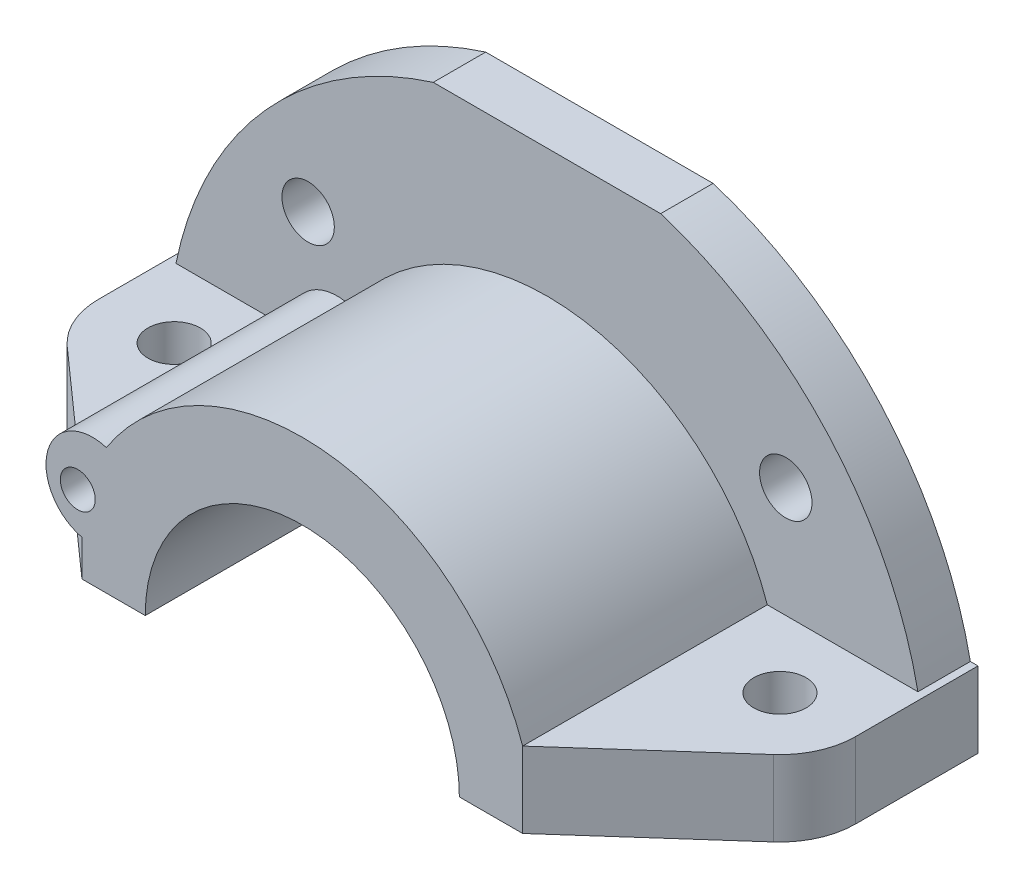
ISO-10303-21;
HEADER;
FILE_DESCRIPTION(('STEP AP214'),'2;1');
FILE_NAME('part.step','',(''),(''),'','','');
FILE_SCHEMA(('AUTOMOTIVE_DESIGN { 1 0 10303 214 1 1 1 1 }'));
ENDSEC;
DATA;
#1=APPLICATION_CONTEXT('core data for automotive mechanical design processes');
#2=APPLICATION_PROTOCOL_DEFINITION('international standard','automotive_design',2000,#1);
#3=PRODUCT_CONTEXT('',#1,'mechanical');
#4=PRODUCT('Part','Part','',(#3));
#5=PRODUCT_RELATED_PRODUCT_CATEGORY('part','',(#4));
#6=PRODUCT_DEFINITION_FORMATION('','',#4);
#7=PRODUCT_DEFINITION_CONTEXT('part definition',#1,'design');
#8=PRODUCT_DEFINITION('design','',#6,#7);
#9=PRODUCT_DEFINITION_SHAPE('','',#8);
#10=(LENGTH_UNIT() NAMED_UNIT(*) SI_UNIT(.MILLI.,.METRE.));
#11=(NAMED_UNIT(*) PLANE_ANGLE_UNIT() SI_UNIT($,.RADIAN.));
#12=(NAMED_UNIT(*) SI_UNIT($,.STERADIAN.) SOLID_ANGLE_UNIT());
#13=UNCERTAINTY_MEASURE_WITH_UNIT(LENGTH_MEASURE(1.E-05),#10,'distance_accuracy_value','');
#14=(GEOMETRIC_REPRESENTATION_CONTEXT(3) GLOBAL_UNCERTAINTY_ASSIGNED_CONTEXT((#13)) GLOBAL_UNIT_ASSIGNED_CONTEXT((#10,
#11,#12)) REPRESENTATION_CONTEXT('',''));
#15=CARTESIAN_POINT('',(0.,0.,0.));
#16=DIRECTION('',(0.,0.,1.));
#17=DIRECTION('',(1.,0.,0.));
#18=AXIS2_PLACEMENT_3D('',#15,#16,#17);
#19=CARTESIAN_POINT('',(0.,13.,51.));
#20=DIRECTION('',(0.,1.,0.));
#21=DIRECTION('',(0.,0.,1.));
#22=AXIS2_PLACEMENT_3D('',#19,#20,#21);
#23=PLANE('',#22);
#24=DIRECTION('',(0.,0.,1.));
#25=VECTOR('',#24,1.);
#26=CARTESIAN_POINT('',(-43.9372539331938,13.,-13.6274169979695));
#27=LINE('',#26,#25);
#28=CARTESIAN_POINT('',(-43.9372539331938,13.,9.));
#29=VERTEX_POINT('',#28);
#30=CARTESIAN_POINT('',(-43.9372539331938,13.,45.5674390370028));
#31=VERTEX_POINT('',#30);
#32=EDGE_CURVE('E197',#29,#31,#27,.T.);
#33=ORIENTED_EDGE('',*,*,#32,.F.);
#34=DIRECTION('',(1.,0.,0.));
#35=VECTOR('',#34,1.);
#36=CARTESIAN_POINT('',(0.,13.,9.));
#37=LINE('',#36,#35);
#38=CARTESIAN_POINT('',(-63.6867333123626,13.,9.));
#39=VERTEX_POINT('',#38);
#40=EDGE_CURVE('E261',#39,#29,#37,.T.);
#41=ORIENTED_EDGE('',*,*,#40,.F.);
#42=DIRECTION('',(0.,0.,-1.));
#43=VECTOR('',#42,1.);
#44=CARTESIAN_POINT('',(-63.6867333123626,13.,9.));
#45=LINE('',#44,#43);
#46=CARTESIAN_POINT('',(-63.6867333123626,13.,0.));
#47=VERTEX_POINT('',#46);
#48=EDGE_CURVE('E286',#39,#47,#45,.T.);
#49=ORIENTED_EDGE('',*,*,#48,.T.);
#50=DIRECTION('',(1.,0.,0.));
#51=VECTOR('',#50,1.);
#52=CARTESIAN_POINT('',(0.,13.,0.));
#53=LINE('',#52,#51);
#54=CARTESIAN_POINT('',(-65.,13.,0.));
#55=VERTEX_POINT('',#54);
#56=EDGE_CURVE('E304',#55,#47,#53,.T.);
#57=ORIENTED_EDGE('',*,*,#56,.F.);
#58=DIRECTION('',(0.,0.,-1.));
#59=VECTOR('',#58,1.);
#60=CARTESIAN_POINT('',(-65.,13.,51.));
#61=LINE('',#60,#59);
#62=CARTESIAN_POINT('',(-65.,13.,21.));
#63=VERTEX_POINT('',#62);
#64=EDGE_CURVE('E312',#63,#55,#61,.T.);
#65=ORIENTED_EDGE('',*,*,#64,.F.);
#66=CARTESIAN_POINT('',(-52.,13.,21.));
#67=DIRECTION('',(0.,1.,0.));
#68=DIRECTION('',(0.,0.,1.));
#69=AXIS2_PLACEMENT_3D('',#66,#67,#68);
#70=CIRCLE('',#69,13.);
#71=CARTESIAN_POINT('',(-60.6390494366874,13.,30.714258841027));
#72=VERTEX_POINT('',#71);
#73=EDGE_CURVE('E204',#72,#63,#70,.F.);
#74=ORIENTED_EDGE('',*,*,#73,.F.);
#75=DIRECTION('',(-0.747250680078999,0.,-0.664542264360571));
#76=VECTOR('',#75,1.);
#77=CARTESIAN_POINT('',(-16.7057135654639,13.,69.7848937418742));
#78=LINE('',#77,#76);
#79=EDGE_CURVE('E216',#31,#72,#78,.T.);
#80=ORIENTED_EDGE('',*,*,#79,.F.);
#81=EDGE_LOOP('',(#33,#41,#49,#57,#65,#74,#80));
#82=FACE_BOUND('',#81,.T.);
#83=CARTESIAN_POINT('',(-52.,13.,21.));
#84=DIRECTION('',(0.,1.,0.));
#85=DIRECTION('',(0.,0.,1.));
#86=AXIS2_PLACEMENT_3D('',#83,#84,#85);
#87=CIRCLE('',#86,4.5);
#88=CARTESIAN_POINT('',(-52.,13.,25.5));
#89=VERTEX_POINT('',#88);
#90=EDGE_CURVE('E218',#89,#89,#87,.F.);
#91=ORIENTED_EDGE('',*,*,#90,.T.);
#92=EDGE_LOOP('',(#91));
#93=FACE_BOUND('',#92,.T.);
#94=ADVANCED_FACE('F60',(#82,#93),#23,.T.);
#95=CARTESIAN_POINT('',(0.,0.,51.));
#96=DIRECTION('',(0.,1.,0.));
#97=DIRECTION('',(0.,0.,1.));
#98=AXIS2_PLACEMENT_3D('',#95,#96,#97);
#99=PLANE('',#98);
#100=CARTESIAN_POINT('',(-52.,0.,21.));
#101=DIRECTION('',(0.,1.,0.));
#102=DIRECTION('',(0.,0.,1.));
#103=AXIS2_PLACEMENT_3D('',#100,#101,#102);
#104=CIRCLE('',#103,4.5);
#105=CARTESIAN_POINT('',(-52.,0.,25.5));
#106=VERTEX_POINT('',#105);
#107=EDGE_CURVE('E223',#106,#106,#104,.F.);
#108=ORIENTED_EDGE('',*,*,#107,.F.);
#109=EDGE_LOOP('',(#108));
#110=FACE_BOUND('',#109,.T.);
#111=DIRECTION('',(1.,0.,0.));
#112=VECTOR('',#111,1.);
#113=CARTESIAN_POINT('',(0.,0.,51.));
#114=LINE('',#113,#112);
#115=CARTESIAN_POINT('',(-37.8285606387555,0.,51.));
#116=VERTEX_POINT('',#115);
#117=CARTESIAN_POINT('',(-26.965,0.,51.));
#118=VERTEX_POINT('',#117);
#119=EDGE_CURVE('E320',#116,#118,#114,.T.);
#120=ORIENTED_EDGE('',*,*,#119,.F.);
#121=DIRECTION('',(-0.747250680078998,0.,-0.664542264360571));
#122=VECTOR('',#121,1.);
#123=CARTESIAN_POINT('',(-37.8285606387555,0.,51.));
#124=LINE('',#123,#122);
#125=CARTESIAN_POINT('',(-60.6390494366874,0.,30.714258841027));
#126=VERTEX_POINT('',#125);
#127=EDGE_CURVE('E202',#116,#126,#124,.T.);
#128=ORIENTED_EDGE('',*,*,#127,.T.);
#129=CARTESIAN_POINT('',(-52.,0.,21.));
#130=DIRECTION('',(0.,-1.,0.));
#131=DIRECTION('',(0.,0.,-1.));
#132=AXIS2_PLACEMENT_3D('',#129,#130,#131);
#133=CIRCLE('',#132,13.);
#134=CARTESIAN_POINT('',(-65.,0.,21.));
#135=VERTEX_POINT('',#134);
#136=EDGE_CURVE('E206',#126,#135,#133,.T.);
#137=ORIENTED_EDGE('',*,*,#136,.T.);
#138=DIRECTION('',(0.,0.,-1.));
#139=VECTOR('',#138,1.);
#140=CARTESIAN_POINT('',(-65.,0.,51.));
#141=LINE('',#140,#139);
#142=CARTESIAN_POINT('',(-65.,0.,0.));
#143=VERTEX_POINT('',#142);
#144=EDGE_CURVE('E310',#135,#143,#141,.T.);
#145=ORIENTED_EDGE('',*,*,#144,.T.);
#146=DIRECTION('',(1.,0.,0.));
#147=VECTOR('',#146,1.);
#148=CARTESIAN_POINT('',(0.,0.,0.));
#149=LINE('',#148,#147);
#150=CARTESIAN_POINT('',(-26.965,0.,0.));
#151=VERTEX_POINT('',#150);
#152=EDGE_CURVE('E328',#143,#151,#149,.T.);
#153=ORIENTED_EDGE('',*,*,#152,.T.);
#154=DIRECTION('',(0.,0.,-1.));
#155=VECTOR('',#154,1.);
#156=CARTESIAN_POINT('',(-26.965,0.,51.));
#157=LINE('',#156,#155);
#158=EDGE_CURVE('E68',#118,#151,#157,.T.);
#159=ORIENTED_EDGE('',*,*,#158,.F.);
#160=EDGE_LOOP('',(#120,#128,#137,#145,#153,#159));
#161=FACE_BOUND('',#160,.T.);
#162=ADVANCED_FACE('F340',(#110,#161),#99,.F.);
#163=CARTESIAN_POINT('',(-65.,0.,51.));
#164=DIRECTION('',(-1.,0.,0.));
#165=DIRECTION('',(0.,0.,1.));
#166=AXIS2_PLACEMENT_3D('',#163,#164,#165);
#167=PLANE('',#166);
#168=ORIENTED_EDGE('',*,*,#144,.F.);
#169=DIRECTION('',(0.,1.,0.));
#170=VECTOR('',#169,1.);
#171=CARTESIAN_POINT('',(-65.,0.,21.));
#172=LINE('',#171,#170);
#173=EDGE_CURVE('E208',#135,#63,#172,.T.);
#174=ORIENTED_EDGE('',*,*,#173,.T.);
#175=ORIENTED_EDGE('',*,*,#64,.T.);
#176=DIRECTION('',(0.,1.,0.));
#177=VECTOR('',#176,1.);
#178=CARTESIAN_POINT('',(-65.,0.,0.));
#179=LINE('',#178,#177);
#180=EDGE_CURVE('E307',#143,#55,#179,.T.);
#181=ORIENTED_EDGE('',*,*,#180,.F.);
#182=EDGE_LOOP('',(#168,#174,#175,#181));
#183=FACE_BOUND('',#182,.T.);
#184=ADVANCED_FACE('F370',(#183),#167,.T.);
#185=CARTESIAN_POINT('',(0.,13.,51.));
#186=DIRECTION('',(0.,1.,0.));
#187=DIRECTION('',(0.,0.,1.));
#188=AXIS2_PLACEMENT_3D('',#185,#186,#187);
#189=PLANE('',#188);
#190=CARTESIAN_POINT('',(52.,13.,21.));
#191=DIRECTION('',(0.,1.,0.));
#192=DIRECTION('',(0.,0.,1.));
#193=AXIS2_PLACEMENT_3D('',#190,#191,#192);
#194=CIRCLE('',#193,13.);
#195=CARTESIAN_POINT('',(60.6390494366874,13.,30.714258841027));
#196=VERTEX_POINT('',#195);
#197=CARTESIAN_POINT('',(65.,13.,21.));
#198=VERTEX_POINT('',#197);
#199=EDGE_CURVE('E233',#196,#198,#194,.T.);
#200=ORIENTED_EDGE('',*,*,#199,.T.);
#201=DIRECTION('',(0.,0.,-1.));
#202=VECTOR('',#201,1.);
#203=CARTESIAN_POINT('',(65.,13.,51.));
#204=LINE('',#203,#202);
#205=CARTESIAN_POINT('',(65.,13.,0.));
#206=VERTEX_POINT('',#205);
#207=EDGE_CURVE('E300',#198,#206,#204,.T.);
#208=ORIENTED_EDGE('',*,*,#207,.T.);
#209=DIRECTION('',(1.,0.,0.));
#210=VECTOR('',#209,1.);
#211=CARTESIAN_POINT('',(0.,13.,0.));
#212=LINE('',#211,#210);
#213=CARTESIAN_POINT('',(63.6867333123626,13.,0.));
#214=VERTEX_POINT('',#213);
#215=EDGE_CURVE('E294',#214,#206,#212,.T.);
#216=ORIENTED_EDGE('',*,*,#215,.F.);
#217=DIRECTION('',(0.,0.,-1.));
#218=VECTOR('',#217,1.);
#219=CARTESIAN_POINT('',(63.6867333123626,13.,9.));
#220=LINE('',#219,#218);
#221=CARTESIAN_POINT('',(63.6867333123626,13.,9.));
#222=VERTEX_POINT('',#221);
#223=EDGE_CURVE('E284',#222,#214,#220,.T.);
#224=ORIENTED_EDGE('',*,*,#223,.F.);
#225=DIRECTION('',(1.,0.,0.));
#226=VECTOR('',#225,1.);
#227=CARTESIAN_POINT('',(0.,13.,9.));
#228=LINE('',#227,#226);
#229=CARTESIAN_POINT('',(37.8285606387555,13.,9.));
#230=VERTEX_POINT('',#229);
#231=EDGE_CURVE('E265',#230,#222,#228,.T.);
#232=ORIENTED_EDGE('',*,*,#231,.F.);
#233=DIRECTION('',(0.,0.,-1.));
#234=VECTOR('',#233,1.);
#235=CARTESIAN_POINT('',(37.8285606387555,13.,51.));
#236=LINE('',#235,#234);
#237=CARTESIAN_POINT('',(37.8285606387555,13.,51.));
#238=VERTEX_POINT('',#237);
#239=EDGE_CURVE('E297',#238,#230,#236,.T.);
#240=ORIENTED_EDGE('',*,*,#239,.F.);
#241=DIRECTION('',(0.747250680078998,0.,-0.664542264360571));
#242=VECTOR('',#241,1.);
#243=CARTESIAN_POINT('',(42.0312761736822,13.,47.2624562646791));
#244=LINE('',#243,#242);
#245=EDGE_CURVE('E226',#238,#196,#244,.T.);
#246=ORIENTED_EDGE('',*,*,#245,.T.);
#247=EDGE_LOOP('',(#200,#208,#216,#224,#232,#240,#246));
#248=FACE_BOUND('',#247,.T.);
#249=CARTESIAN_POINT('',(52.,13.,21.));
#250=DIRECTION('',(0.,1.,0.));
#251=DIRECTION('',(0.,0.,1.));
#252=AXIS2_PLACEMENT_3D('',#249,#250,#251);
#253=CIRCLE('',#252,4.5);
#254=CARTESIAN_POINT('',(52.,13.,25.5));
#255=VERTEX_POINT('',#254);
#256=EDGE_CURVE('E222',#255,#255,#253,.T.);
#257=ORIENTED_EDGE('',*,*,#256,.F.);
#258=EDGE_LOOP('',(#257));
#259=FACE_BOUND('',#258,.T.);
#260=ADVANCED_FACE('F390',(#248,#259),#189,.T.);
#261=DIRECTION('',(0.,0.,-1.));
#262=VECTOR('',#261,1.);
#263=CARTESIAN_POINT('',(65.,0.,51.));
#264=LINE('',#263,#262);
#265=CARTESIAN_POINT('',(65.,0.,21.));
#266=VERTEX_POINT('',#265);
#267=CARTESIAN_POINT('',(65.,0.,0.));
#268=VERTEX_POINT('',#267);
#269=EDGE_CURVE('E302',#266,#268,#264,.T.);
#270=ORIENTED_EDGE('',*,*,#269,.F.);
#271=CARTESIAN_POINT('',(52.,0.,21.));
#272=DIRECTION('',(0.,1.,0.));
#273=DIRECTION('',(0.,0.,1.));
#274=AXIS2_PLACEMENT_3D('',#271,#272,#273);
#275=CIRCLE('',#274,13.);
#276=CARTESIAN_POINT('',(60.6390494366874,0.,30.714258841027));
#277=VERTEX_POINT('',#276);
#278=EDGE_CURVE('E236',#277,#266,#275,.T.);
#279=ORIENTED_EDGE('',*,*,#278,.F.);
#280=DIRECTION('',(0.747250680078998,0.,-0.664542264360571));
#281=VECTOR('',#280,1.);
#282=CARTESIAN_POINT('',(42.0312761736822,0.,47.2624562646791));
#283=LINE('',#282,#281);
#284=CARTESIAN_POINT('',(37.8285606387555,0.,51.));
#285=VERTEX_POINT('',#284);
#286=EDGE_CURVE('E238',#285,#277,#283,.T.);
#287=ORIENTED_EDGE('',*,*,#286,.F.);
#288=CARTESIAN_POINT('',(26.965,0.,51.));
#289=VERTEX_POINT('',#288);
#290=EDGE_CURVE('E315',#289,#285,#114,.T.);
#291=ORIENTED_EDGE('',*,*,#290,.F.);
#292=DIRECTION('',(0.,0.,-1.));
#293=VECTOR('',#292,1.);
#294=CARTESIAN_POINT('',(26.965,0.,51.));
#295=LINE('',#294,#293);
#296=CARTESIAN_POINT('',(26.965,0.,0.));
#297=VERTEX_POINT('',#296);
#298=EDGE_CURVE('E325',#289,#297,#295,.T.);
#299=ORIENTED_EDGE('',*,*,#298,.T.);
#300=EDGE_CURVE('E314',#297,#268,#149,.T.);
#301=ORIENTED_EDGE('',*,*,#300,.T.);
#302=EDGE_LOOP('',(#270,#279,#287,#291,#299,#301));
#303=FACE_BOUND('',#302,.T.);
#304=CARTESIAN_POINT('',(52.,0.,21.));
#305=DIRECTION('',(0.,1.,0.));
#306=DIRECTION('',(0.,0.,1.));
#307=AXIS2_PLACEMENT_3D('',#304,#305,#306);
#308=CIRCLE('',#307,4.5);
#309=CARTESIAN_POINT('',(52.,0.,25.5));
#310=VERTEX_POINT('',#309);
#311=EDGE_CURVE('E219',#310,#310,#308,.T.);
#312=ORIENTED_EDGE('',*,*,#311,.T.);
#313=EDGE_LOOP('',(#312));
#314=FACE_BOUND('',#313,.T.);
#315=ADVANCED_FACE('F350',(#303,#314),#99,.F.);
#316=CARTESIAN_POINT('',(65.,0.,51.));
#317=DIRECTION('',(-1.,0.,0.));
#318=DIRECTION('',(0.,0.,1.));
#319=AXIS2_PLACEMENT_3D('',#316,#317,#318);
#320=PLANE('',#319);
#321=DIRECTION('',(0.,-1.,0.));
#322=VECTOR('',#321,1.);
#323=CARTESIAN_POINT('',(65.,62.001,21.));
#324=LINE('',#323,#322);
#325=EDGE_CURVE('E241',#198,#266,#324,.T.);
#326=ORIENTED_EDGE('',*,*,#325,.T.);
#327=ORIENTED_EDGE('',*,*,#269,.T.);
#328=DIRECTION('',(0.,1.,0.));
#329=VECTOR('',#328,1.);
#330=CARTESIAN_POINT('',(65.,0.,0.));
#331=LINE('',#330,#329);
#332=EDGE_CURVE('E291',#268,#206,#331,.T.);
#333=ORIENTED_EDGE('',*,*,#332,.T.);
#334=ORIENTED_EDGE('',*,*,#207,.F.);
#335=EDGE_LOOP('',(#326,#327,#333,#334));
#336=FACE_BOUND('',#335,.T.);
#337=ADVANCED_FACE('F396',(#336),#320,.F.);
#338=CARTESIAN_POINT('',(0.,0.,51.));
#339=DIRECTION('',(0.,0.,-1.));
#340=DIRECTION('',(-1.,0.,0.));
#341=AXIS2_PLACEMENT_3D('',#338,#339,#340);
#342=CYLINDRICAL_SURFACE('',#341,40.);
#343=CARTESIAN_POINT('',(0.,0.,9.));
#344=DIRECTION('',(0.,0.,1.));
#345=DIRECTION('',(1.,0.,0.));
#346=AXIS2_PLACEMENT_3D('',#343,#344,#345);
#347=CIRCLE('',#346,40.);
#348=CARTESIAN_POINT('',(-33.6386188705644,21.6435514756915,9.));
#349=VERTEX_POINT('',#348);
#350=EDGE_CURVE('E263',#230,#349,#347,.T.);
#351=ORIENTED_EDGE('',*,*,#350,.T.);
#352=DIRECTION('',(0.,0.,1.));
#353=VECTOR('',#352,1.);
#354=CARTESIAN_POINT('',(-33.6386188705644,21.6435514756915,30.));
#355=LINE('',#354,#353);
#356=CARTESIAN_POINT('',(-33.6386188705644,21.6435514756915,51.));
#357=VERTEX_POINT('',#356);
#358=EDGE_CURVE('E75',#349,#357,#355,.T.);
#359=ORIENTED_EDGE('',*,*,#358,.T.);
#360=CARTESIAN_POINT('',(0.,0.,51.));
#361=DIRECTION('',(0.,0.,1.));
#362=DIRECTION('',(1.,0.,0.));
#363=AXIS2_PLACEMENT_3D('',#360,#361,#362);
#364=CIRCLE('',#363,40.);
#365=EDGE_CURVE('E318',#238,#357,#364,.T.);
#366=ORIENTED_EDGE('',*,*,#365,.F.);
#367=ORIENTED_EDGE('',*,*,#239,.T.);
#368=EDGE_LOOP('',(#351,#359,#366,#367));
#369=FACE_BOUND('',#368,.T.);
#370=ADVANCED_FACE('F62',(#369),#342,.T.);
#371=CARTESIAN_POINT('',(0.,0.,51.));
#372=DIRECTION('',(0.,0.,-1.));
#373=DIRECTION('',(-1.,0.,0.));
#374=AXIS2_PLACEMENT_3D('',#371,#372,#373);
#375=CYLINDRICAL_SURFACE('',#374,26.965);
#376=CARTESIAN_POINT('',(0.,0.,0.));
#377=DIRECTION('',(0.,0.,1.));
#378=DIRECTION('',(1.,0.,0.));
#379=AXIS2_PLACEMENT_3D('',#376,#377,#378);
#380=CIRCLE('',#379,26.965);
#381=EDGE_CURVE('E319',#297,#151,#380,.T.);
#382=ORIENTED_EDGE('',*,*,#381,.F.);
#383=ORIENTED_EDGE('',*,*,#298,.F.);
#384=CARTESIAN_POINT('',(0.,0.,51.));
#385=DIRECTION('',(0.,0.,1.));
#386=DIRECTION('',(1.,0.,0.));
#387=AXIS2_PLACEMENT_3D('',#384,#385,#386);
#388=CIRCLE('',#387,26.965);
#389=EDGE_CURVE('E322',#289,#118,#388,.T.);
#390=ORIENTED_EDGE('',*,*,#389,.T.);
#391=ORIENTED_EDGE('',*,*,#158,.T.);
#392=EDGE_LOOP('',(#382,#383,#390,#391));
#393=FACE_BOUND('',#392,.T.);
#394=ADVANCED_FACE('F335',(#393),#375,.F.);
#395=CARTESIAN_POINT('',(0.,0.,51.));
#396=DIRECTION('',(0.,0.,1.));
#397=DIRECTION('',(1.,0.,0.));
#398=AXIS2_PLACEMENT_3D('',#395,#396,#397);
#399=PLANE('',#398);
#400=CARTESIAN_POINT('',(-38.5450119335402,12.9381967367957,51.));
#401=DIRECTION('',(0.,0.,1.));
#402=DIRECTION('',(1.,0.,0.));
#403=AXIS2_PLACEMENT_3D('',#400,#401,#402);
#404=CIRCLE('',#403,3.);
#405=CARTESIAN_POINT('',(-35.5450119335402,12.9381967367957,51.));
#406=VERTEX_POINT('',#405);
#407=EDGE_CURVE('E189',#406,#406,#404,.T.);
#408=ORIENTED_EDGE('',*,*,#407,.F.);
#409=EDGE_LOOP('',(#408));
#410=FACE_BOUND('',#409,.T.);
#411=ORIENTED_EDGE('',*,*,#365,.T.);
#412=CARTESIAN_POINT('',(-36.,14.,51.));
#413=DIRECTION('',(0.,0.,1.));
#414=DIRECTION('',(1.,0.,0.));
#415=AXIS2_PLACEMENT_3D('',#412,#413,#414);
#416=CIRCLE('',#415,8.);
#417=CARTESIAN_POINT('',(-37.8285606387555,6.2117803067457,51.));
#418=VERTEX_POINT('',#417);
#419=EDGE_CURVE('E188',#357,#418,#416,.T.);
#420=ORIENTED_EDGE('',*,*,#419,.T.);
#421=DIRECTION('',(0.,1.,0.));
#422=VECTOR('',#421,1.);
#423=CARTESIAN_POINT('',(-37.8285606387555,0.,51.));
#424=LINE('',#423,#422);
#425=EDGE_CURVE('E205',#116,#418,#424,.T.);
#426=ORIENTED_EDGE('',*,*,#425,.F.);
#427=ORIENTED_EDGE('',*,*,#119,.T.);
#428=ORIENTED_EDGE('',*,*,#389,.F.);
#429=ORIENTED_EDGE('',*,*,#290,.T.);
#430=DIRECTION('',(0.,-1.,0.));
#431=VECTOR('',#430,1.);
#432=CARTESIAN_POINT('',(37.8285606387555,62.001,51.));
#433=LINE('',#432,#431);
#434=EDGE_CURVE('E244',#238,#285,#433,.T.);
#435=ORIENTED_EDGE('',*,*,#434,.F.);
#436=EDGE_LOOP('',(#411,#420,#426,#427,#428,#429,#435));
#437=FACE_BOUND('',#436,.T.);
#438=ADVANCED_FACE('F357',(#410,#437),#399,.T.);
#439=CARTESIAN_POINT('',(0.,0.,0.));
#440=DIRECTION('',(0.,0.,1.));
#441=DIRECTION('',(1.,0.,0.));
#442=AXIS2_PLACEMENT_3D('',#439,#440,#441);
#443=PLANE('',#442);
#444=ORIENTED_EDGE('',*,*,#300,.F.);
#445=ORIENTED_EDGE('',*,*,#381,.T.);
#446=ORIENTED_EDGE('',*,*,#152,.F.);
#447=ORIENTED_EDGE('',*,*,#180,.T.);
#448=ORIENTED_EDGE('',*,*,#56,.T.);
#449=CARTESIAN_POINT('',(0.,0.,0.));
#450=DIRECTION('',(0.,0.,1.));
#451=DIRECTION('',(1.,0.,0.));
#452=AXIS2_PLACEMENT_3D('',#449,#450,#451);
#453=CIRCLE('',#452,65.);
#454=CARTESIAN_POINT('',(-19.5192212959432,62.,0.));
#455=VERTEX_POINT('',#454);
#456=EDGE_CURVE('E279',#455,#47,#453,.T.);
#457=ORIENTED_EDGE('',*,*,#456,.F.);
#458=DIRECTION('',(1.,0.,0.));
#459=VECTOR('',#458,1.);
#460=CARTESIAN_POINT('',(0.,62.,0.));
#461=LINE('',#460,#459);
#462=CARTESIAN_POINT('',(19.5192212959432,62.,0.));
#463=VERTEX_POINT('',#462);
#464=EDGE_CURVE('E276',#455,#463,#461,.T.);
#465=ORIENTED_EDGE('',*,*,#464,.T.);
#466=CARTESIAN_POINT('',(0.,0.,0.));
#467=DIRECTION('',(0.,0.,1.));
#468=DIRECTION('',(1.,0.,0.));
#469=AXIS2_PLACEMENT_3D('',#466,#467,#468);
#470=CIRCLE('',#469,65.);
#471=EDGE_CURVE('E253',#214,#463,#470,.T.);
#472=ORIENTED_EDGE('',*,*,#471,.F.);
#473=ORIENTED_EDGE('',*,*,#215,.T.);
#474=ORIENTED_EDGE('',*,*,#332,.F.);
#475=EDGE_LOOP('',(#444,#445,#446,#447,#448,#457,#465,#472,#473,#474));
#476=FACE_BOUND('',#475,.T.);
#477=CARTESIAN_POINT('',(41.,32.,0.));
#478=DIRECTION('',(0.,0.,1.));
#479=DIRECTION('',(1.,0.,0.));
#480=AXIS2_PLACEMENT_3D('',#477,#478,#479);
#481=CIRCLE('',#480,4.5);
#482=CARTESIAN_POINT('',(45.5,32.,0.));
#483=VERTEX_POINT('',#482);
#484=EDGE_CURVE('E248',#483,#483,#481,.F.);
#485=ORIENTED_EDGE('',*,*,#484,.F.);
#486=EDGE_LOOP('',(#485));
#487=FACE_BOUND('',#486,.T.);
#488=CARTESIAN_POINT('',(-41.,32.,0.));
#489=DIRECTION('',(0.,0.,1.));
#490=DIRECTION('',(1.,0.,0.));
#491=AXIS2_PLACEMENT_3D('',#488,#489,#490);
#492=CIRCLE('',#491,4.5);
#493=CARTESIAN_POINT('',(-36.5,32.,0.));
#494=VERTEX_POINT('',#493);
#495=EDGE_CURVE('E273',#494,#494,#492,.T.);
#496=ORIENTED_EDGE('',*,*,#495,.T.);
#497=EDGE_LOOP('',(#496));
#498=FACE_BOUND('',#497,.T.);
#499=ADVANCED_FACE('F345',(#476,#487,#498),#443,.F.);
#500=CARTESIAN_POINT('',(0.,62.,9.));
#501=DIRECTION('',(0.,1.,0.));
#502=DIRECTION('',(0.,0.,1.));
#503=AXIS2_PLACEMENT_3D('',#500,#501,#502);
#504=PLANE('',#503);
#505=ORIENTED_EDGE('',*,*,#464,.F.);
#506=DIRECTION('',(0.,0.,-1.));
#507=VECTOR('',#506,1.);
#508=CARTESIAN_POINT('',(-19.5192212959432,62.,9.));
#509=LINE('',#508,#507);
#510=CARTESIAN_POINT('',(-19.5192212959432,62.,9.));
#511=VERTEX_POINT('',#510);
#512=EDGE_CURVE('E289',#511,#455,#509,.T.);
#513=ORIENTED_EDGE('',*,*,#512,.F.);
#514=DIRECTION('',(1.,0.,0.));
#515=VECTOR('',#514,1.);
#516=CARTESIAN_POINT('',(0.,62.,9.));
#517=LINE('',#516,#515);
#518=CARTESIAN_POINT('',(19.5192212959432,62.,9.));
#519=VERTEX_POINT('',#518);
#520=EDGE_CURVE('E256',#511,#519,#517,.T.);
#521=ORIENTED_EDGE('',*,*,#520,.T.);
#522=DIRECTION('',(0.,0.,-1.));
#523=VECTOR('',#522,1.);
#524=CARTESIAN_POINT('',(19.5192212959432,62.,9.));
#525=LINE('',#524,#523);
#526=EDGE_CURVE('E270',#519,#463,#525,.T.);
#527=ORIENTED_EDGE('',*,*,#526,.T.);
#528=EDGE_LOOP('',(#505,#513,#521,#527));
#529=FACE_BOUND('',#528,.T.);
#530=ADVANCED_FACE('F383',(#529),#504,.T.);
#531=CARTESIAN_POINT('',(0.,0.,9.));
#532=DIRECTION('',(0.,0.,-1.));
#533=DIRECTION('',(-1.,0.,0.));
#534=AXIS2_PLACEMENT_3D('',#531,#532,#533);
#535=CYLINDRICAL_SURFACE('',#534,65.);
#536=ORIENTED_EDGE('',*,*,#456,.T.);
#537=ORIENTED_EDGE('',*,*,#48,.F.);
#538=CARTESIAN_POINT('',(0.,0.,9.));
#539=DIRECTION('',(0.,0.,1.));
#540=DIRECTION('',(1.,0.,0.));
#541=AXIS2_PLACEMENT_3D('',#538,#539,#540);
#542=CIRCLE('',#541,65.);
#543=EDGE_CURVE('E259',#511,#39,#542,.T.);
#544=ORIENTED_EDGE('',*,*,#543,.F.);
#545=ORIENTED_EDGE('',*,*,#512,.T.);
#546=EDGE_LOOP('',(#536,#537,#544,#545));
#547=FACE_BOUND('',#546,.T.);
#548=ADVANCED_FACE('F380',(#547),#535,.T.);
#549=CARTESIAN_POINT('',(-41.,32.,9.));
#550=DIRECTION('',(0.,0.,-1.));
#551=DIRECTION('',(-1.,0.,0.));
#552=AXIS2_PLACEMENT_3D('',#549,#550,#551);
#553=CYLINDRICAL_SURFACE('',#552,4.5);
#554=CARTESIAN_POINT('',(-41.,32.,9.));
#555=DIRECTION('',(0.,0.,1.));
#556=DIRECTION('',(1.,0.,0.));
#557=AXIS2_PLACEMENT_3D('',#554,#555,#556);
#558=CIRCLE('',#557,4.5);
#559=CARTESIAN_POINT('',(-36.5,32.,9.));
#560=VERTEX_POINT('',#559);
#561=EDGE_CURVE('E252',#560,#560,#558,.T.);
#562=ORIENTED_EDGE('',*,*,#561,.T.);
#563=EDGE_LOOP('',(#562));
#564=FACE_BOUND('',#563,.T.);
#565=ORIENTED_EDGE('',*,*,#495,.F.);
#566=EDGE_LOOP('',(#565));
#567=FACE_BOUND('',#566,.T.);
#568=ADVANCED_FACE('F443',(#564,#567),#553,.F.);
#569=CARTESIAN_POINT('',(41.,32.,9.));
#570=DIRECTION('',(0.,0.,-1.));
#571=DIRECTION('',(-1.,0.,0.));
#572=AXIS2_PLACEMENT_3D('',#569,#570,#571);
#573=CYLINDRICAL_SURFACE('',#572,4.5);
#574=CARTESIAN_POINT('',(41.,32.,9.));
#575=DIRECTION('',(0.,0.,1.));
#576=DIRECTION('',(1.,0.,0.));
#577=AXIS2_PLACEMENT_3D('',#574,#575,#576);
#578=CIRCLE('',#577,4.5);
#579=CARTESIAN_POINT('',(45.5,32.,9.));
#580=VERTEX_POINT('',#579);
#581=EDGE_CURVE('E249',#580,#580,#578,.F.);
#582=ORIENTED_EDGE('',*,*,#581,.F.);
#583=EDGE_LOOP('',(#582));
#584=FACE_BOUND('',#583,.T.);
#585=ORIENTED_EDGE('',*,*,#484,.T.);
#586=EDGE_LOOP('',(#585));
#587=FACE_BOUND('',#586,.T.);
#588=ADVANCED_FACE('F439',(#584,#587),#573,.F.);
#589=CARTESIAN_POINT('',(0.,0.,9.));
#590=DIRECTION('',(0.,0.,-1.));
#591=DIRECTION('',(-1.,0.,0.));
#592=AXIS2_PLACEMENT_3D('',#589,#590,#591);
#593=CYLINDRICAL_SURFACE('',#592,65.);
#594=ORIENTED_EDGE('',*,*,#471,.T.);
#595=ORIENTED_EDGE('',*,*,#526,.F.);
#596=CARTESIAN_POINT('',(0.,0.,9.));
#597=DIRECTION('',(0.,0.,1.));
#598=DIRECTION('',(1.,0.,0.));
#599=AXIS2_PLACEMENT_3D('',#596,#597,#598);
#600=CIRCLE('',#599,65.);
#601=EDGE_CURVE('E268',#222,#519,#600,.T.);
#602=ORIENTED_EDGE('',*,*,#601,.F.);
#603=ORIENTED_EDGE('',*,*,#223,.T.);
#604=EDGE_LOOP('',(#594,#595,#602,#603));
#605=FACE_BOUND('',#604,.T.);
#606=ADVANCED_FACE('F442',(#605),#593,.T.);
#607=CARTESIAN_POINT('',(0.,0.,9.));
#608=DIRECTION('',(0.,0.,1.));
#609=DIRECTION('',(1.,0.,0.));
#610=AXIS2_PLACEMENT_3D('',#607,#608,#609);
#611=PLANE('',#610);
#612=CARTESIAN_POINT('',(-36.,14.,9.));
#613=DIRECTION('',(0.,0.,1.));
#614=DIRECTION('',(1.,0.,0.));
#615=AXIS2_PLACEMENT_3D('',#612,#613,#614);
#616=CIRCLE('',#615,8.);
#617=EDGE_CURVE('E83',#29,#349,#616,.F.);
#618=ORIENTED_EDGE('',*,*,#617,.T.);
#619=ORIENTED_EDGE('',*,*,#350,.F.);
#620=ORIENTED_EDGE('',*,*,#231,.T.);
#621=ORIENTED_EDGE('',*,*,#601,.T.);
#622=ORIENTED_EDGE('',*,*,#520,.F.);
#623=ORIENTED_EDGE('',*,*,#543,.T.);
#624=ORIENTED_EDGE('',*,*,#40,.T.);
#625=EDGE_LOOP('',(#618,#619,#620,#621,#622,#623,#624));
#626=FACE_BOUND('',#625,.T.);
#627=ORIENTED_EDGE('',*,*,#581,.T.);
#628=EDGE_LOOP('',(#627));
#629=FACE_BOUND('',#628,.T.);
#630=ORIENTED_EDGE('',*,*,#561,.F.);
#631=EDGE_LOOP('',(#630));
#632=FACE_BOUND('',#631,.T.);
#633=ADVANCED_FACE('F403',(#626,#629,#632),#611,.T.);
#634=CARTESIAN_POINT('',(52.,62.001,21.));
#635=DIRECTION('',(0.,-1.,0.));
#636=DIRECTION('',(0.,0.,-1.));
#637=AXIS2_PLACEMENT_3D('',#634,#635,#636);
#638=CYLINDRICAL_SURFACE('',#637,13.);
#639=DIRECTION('',(0.,-1.,0.));
#640=VECTOR('',#639,1.);
#641=CARTESIAN_POINT('',(60.6390494366874,62.001,30.714258841027));
#642=LINE('',#641,#640);
#643=EDGE_CURVE('E246',#196,#277,#642,.T.);
#644=ORIENTED_EDGE('',*,*,#643,.T.);
#645=ORIENTED_EDGE('',*,*,#278,.T.);
#646=ORIENTED_EDGE('',*,*,#325,.F.);
#647=ORIENTED_EDGE('',*,*,#199,.F.);
#648=EDGE_LOOP('',(#644,#645,#646,#647));
#649=FACE_BOUND('',#648,.T.);
#650=ADVANCED_FACE('F398',(#649),#638,.T.);
#651=CARTESIAN_POINT('',(42.0312761736822,62.001,47.2624562646791));
#652=DIRECTION('',(-0.664542264360571,0.,-0.747250680078998));
#653=DIRECTION('',(-0.747250680078998,0.,0.664542264360571));
#654=AXIS2_PLACEMENT_3D('',#651,#652,#653);
#655=PLANE('',#654);
#656=ORIENTED_EDGE('',*,*,#434,.T.);
#657=ORIENTED_EDGE('',*,*,#286,.T.);
#658=ORIENTED_EDGE('',*,*,#643,.F.);
#659=ORIENTED_EDGE('',*,*,#245,.F.);
#660=EDGE_LOOP('',(#656,#657,#658,#659));
#661=FACE_BOUND('',#660,.T.);
#662=ADVANCED_FACE('F400',(#661),#655,.F.);
#663=CARTESIAN_POINT('',(-52.,62.001,21.));
#664=DIRECTION('',(0.,-1.,0.));
#665=DIRECTION('',(0.,0.,-1.));
#666=AXIS2_PLACEMENT_3D('',#663,#664,#665);
#667=CYLINDRICAL_SURFACE('',#666,4.5);
#668=ORIENTED_EDGE('',*,*,#90,.F.);
#669=EDGE_LOOP('',(#668));
#670=FACE_BOUND('',#669,.T.);
#671=ORIENTED_EDGE('',*,*,#107,.T.);
#672=EDGE_LOOP('',(#671));
#673=FACE_BOUND('',#672,.T.);
#674=ADVANCED_FACE('F460',(#670,#673),#667,.F.);
#675=CARTESIAN_POINT('',(52.,62.001,21.));
#676=DIRECTION('',(0.,-1.,0.));
#677=DIRECTION('',(0.,0.,-1.));
#678=AXIS2_PLACEMENT_3D('',#675,#676,#677);
#679=CYLINDRICAL_SURFACE('',#678,4.5);
#680=ORIENTED_EDGE('',*,*,#256,.T.);
#681=EDGE_LOOP('',(#680));
#682=FACE_BOUND('',#681,.T.);
#683=ORIENTED_EDGE('',*,*,#311,.F.);
#684=EDGE_LOOP('',(#683));
#685=FACE_BOUND('',#684,.T.);
#686=ADVANCED_FACE('F463',(#682,#685),#679,.F.);
#687=CARTESIAN_POINT('',(-37.8285606387555,0.,51.));
#688=DIRECTION('',(0.66454226436057,0.,-0.747250680078998));
#689=DIRECTION('',(-0.747250680078999,0.,-0.664542264360571));
#690=AXIS2_PLACEMENT_3D('',#687,#688,#689);
#691=PLANE('',#690);
#692=ORIENTED_EDGE('',*,*,#425,.T.);
#693=CARTESIAN_POINT('',(-36.,14.,52.6261689146549));
#694=DIRECTION('',(0.66454226436057,0.,-0.747250680078998));
#695=DIRECTION('',(0.747250680078998,0.,0.66454226436057));
#696=AXIS2_PLACEMENT_3D('',#693,#694,#695);
#697=ELLIPSE('',#696,10.7059119693999,8.);
#698=EDGE_CURVE('E12',#418,#31,#697,.T.);
#699=ORIENTED_EDGE('',*,*,#698,.T.);
#700=ORIENTED_EDGE('',*,*,#79,.T.);
#701=DIRECTION('',(0.,1.,0.));
#702=VECTOR('',#701,1.);
#703=CARTESIAN_POINT('',(-60.6390494366874,0.,30.714258841027));
#704=LINE('',#703,#702);
#705=EDGE_CURVE('E201',#126,#72,#704,.T.);
#706=ORIENTED_EDGE('',*,*,#705,.F.);
#707=ORIENTED_EDGE('',*,*,#127,.F.);
#708=EDGE_LOOP('',(#692,#699,#700,#706,#707));
#709=FACE_BOUND('',#708,.T.);
#710=ADVANCED_FACE('F362',(#709),#691,.F.);
#711=CARTESIAN_POINT('',(-52.,0.,21.));
#712=DIRECTION('',(0.,1.,0.));
#713=DIRECTION('',(0.,0.,1.));
#714=AXIS2_PLACEMENT_3D('',#711,#712,#713);
#715=CYLINDRICAL_SURFACE('',#714,13.);
#716=ORIENTED_EDGE('',*,*,#705,.T.);
#717=ORIENTED_EDGE('',*,*,#73,.T.);
#718=ORIENTED_EDGE('',*,*,#173,.F.);
#719=ORIENTED_EDGE('',*,*,#136,.F.);
#720=EDGE_LOOP('',(#716,#717,#718,#719));
#721=FACE_BOUND('',#720,.T.);
#722=ADVANCED_FACE('F367',(#721),#715,.T.);
#723=CARTESIAN_POINT('',(-36.,14.,-13.6274169979695));
#724=DIRECTION('',(0.,0.,1.));
#725=DIRECTION('',(1.,0.,0.));
#726=AXIS2_PLACEMENT_3D('',#723,#724,#725);
#727=CYLINDRICAL_SURFACE('',#726,8.);
#728=ORIENTED_EDGE('',*,*,#358,.F.);
#729=ORIENTED_EDGE('',*,*,#617,.F.);
#730=ORIENTED_EDGE('',*,*,#32,.T.);
#731=ORIENTED_EDGE('',*,*,#698,.F.);
#732=ORIENTED_EDGE('',*,*,#419,.F.);
#733=EDGE_LOOP('',(#728,#729,#730,#731,#732));
#734=FACE_BOUND('',#733,.T.);
#735=ADVANCED_FACE('F182',(#734),#727,.T.);
#736=CARTESIAN_POINT('',(-38.5450119335402,12.9381967367957,38.));
#737=DIRECTION('',(0.,0.,1.));
#738=DIRECTION('',(1.,0.,0.));
#739=AXIS2_PLACEMENT_3D('',#736,#737,#738);
#740=CONICAL_SURFACE('',#739,2.99999999999999,1.02974425867665);
#741=CARTESIAN_POINT('',(-38.5450119335402,12.9381967367957,36.1974181429173));
#742=VERTEX_POINT('',#741);
#743=VERTEX_LOOP('',#742);
#744=FACE_BOUND('',#743,.T.);
#745=CARTESIAN_POINT('',(-38.5450119335402,12.9381967367957,38.));
#746=DIRECTION('',(0.,0.,1.));
#747=DIRECTION('',(1.,0.,0.));
#748=AXIS2_PLACEMENT_3D('',#745,#746,#747);
#749=CIRCLE('',#748,2.99999999999999);
#750=CARTESIAN_POINT('',(-35.5450119335402,12.9381967367957,38.));
#751=VERTEX_POINT('',#750);
#752=EDGE_CURVE('E186',#751,#751,#749,.T.);
#753=ORIENTED_EDGE('',*,*,#752,.T.);
#754=EDGE_LOOP('',(#753));
#755=FACE_BOUND('',#754,.T.);
#756=ADVANCED_FACE('F178',(#744,#755),#740,.F.);
#757=CARTESIAN_POINT('',(-38.5450119335402,12.9381967367957,51.));
#758=DIRECTION('',(0.,0.,1.));
#759=DIRECTION('',(1.,0.,0.));
#760=AXIS2_PLACEMENT_3D('',#757,#758,#759);
#761=CYLINDRICAL_SURFACE('',#760,2.99999999999999);
#762=ORIENTED_EDGE('',*,*,#752,.F.);
#763=EDGE_LOOP('',(#762));
#764=FACE_BOUND('',#763,.T.);
#765=ORIENTED_EDGE('',*,*,#407,.T.);
#766=EDGE_LOOP('',(#765));
#767=FACE_BOUND('',#766,.T.);
#768=ADVANCED_FACE('F181',(#764,#767),#761,.F.);
#769=CLOSED_SHELL('',(#94,#162,#184,#260,#315,#337,#370,#394,#438,#499,#530,#548,#568,#588,#606,
#633,#650,#662,#674,#686,#710,#722,#735,#756,#768));
#770=MANIFOLD_SOLID_BREP('B2',#769);
#771=ADVANCED_BREP_SHAPE_REPRESENTATION('',(#18,#770),#14);
#772=SHAPE_DEFINITION_REPRESENTATION(#9,#771);
ENDSEC;
END-ISO-10303-21;
